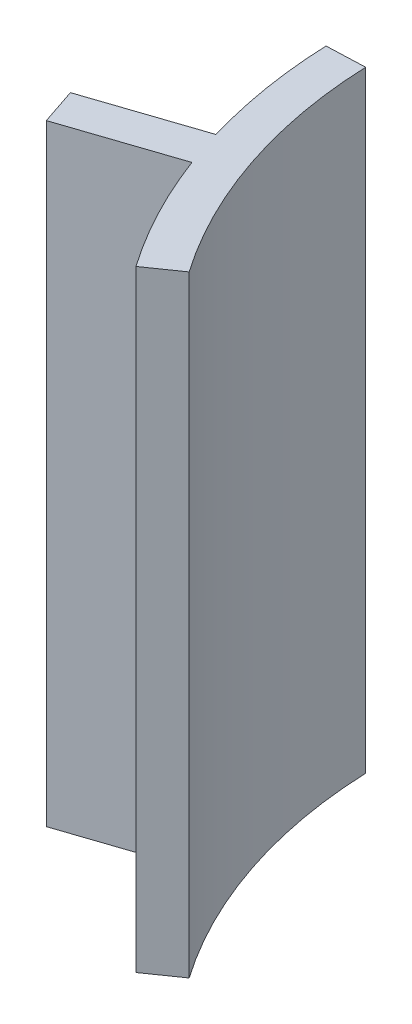
ISO-10303-21;
HEADER;
FILE_DESCRIPTION(('STEP AP214'),'2;1');
FILE_NAME('part.step','',(''),(''),'','','');
FILE_SCHEMA(('AUTOMOTIVE_DESIGN { 1 0 10303 214 1 1 1 1 }'));
ENDSEC;
DATA;
#1=APPLICATION_CONTEXT('core data for automotive mechanical design processes');
#2=APPLICATION_PROTOCOL_DEFINITION('international standard','automotive_design',2000,#1);
#3=PRODUCT_CONTEXT('',#1,'mechanical');
#4=PRODUCT('Part','Part','',(#3));
#5=PRODUCT_RELATED_PRODUCT_CATEGORY('part','',(#4));
#6=PRODUCT_DEFINITION_FORMATION('','',#4);
#7=PRODUCT_DEFINITION_CONTEXT('part definition',#1,'design');
#8=PRODUCT_DEFINITION('design','',#6,#7);
#9=PRODUCT_DEFINITION_SHAPE('','',#8);
#10=(LENGTH_UNIT() NAMED_UNIT(*) SI_UNIT(.MILLI.,.METRE.));
#11=(NAMED_UNIT(*) PLANE_ANGLE_UNIT() SI_UNIT($,.RADIAN.));
#12=(NAMED_UNIT(*) SI_UNIT($,.STERADIAN.) SOLID_ANGLE_UNIT());
#13=UNCERTAINTY_MEASURE_WITH_UNIT(LENGTH_MEASURE(1.E-05),#10,'distance_accuracy_value','');
#14=(GEOMETRIC_REPRESENTATION_CONTEXT(3) GLOBAL_UNCERTAINTY_ASSIGNED_CONTEXT((#13)) GLOBAL_UNIT_ASSIGNED_CONTEXT((#10,
#11,#12)) REPRESENTATION_CONTEXT('',''));
#15=CARTESIAN_POINT('',(0.,0.,0.));
#16=DIRECTION('',(0.,0.,1.));
#17=DIRECTION('',(1.,0.,0.));
#18=AXIS2_PLACEMENT_3D('',#15,#16,#17);
#19=CARTESIAN_POINT('',(0.794627868658572,80.,2.37035156682687));
#20=DIRECTION('',(-0.317851147463239,0.,-0.948140626730182));
#21=DIRECTION('',(-0.948140626730182,0.,0.317851147463239));
#22=AXIS2_PLACEMENT_3D('',#19,#20,#21);
#23=PLANE('',#22);
#24=DIRECTION('',(0.948140626730182,0.,-0.317851147463239));
#25=VECTOR('',#24,1.);
#26=CARTESIAN_POINT('',(0.794627868658572,0.,2.37035156682687));
#27=LINE('',#26,#25);
#28=CARTESIAN_POINT('',(-79.7973254034787,0.,29.3876991012263));
#29=VERTEX_POINT('',#28);
#30=CARTESIAN_POINT('',(-65.5328747900053,0.,24.6057375782174));
#31=VERTEX_POINT('',#30);
#32=EDGE_CURVE('E142',#29,#31,#27,.T.);
#33=ORIENTED_EDGE('',*,*,#32,.T.);
#34=DIRECTION('',(0.,-1.,0.));
#35=VECTOR('',#34,1.);
#36=CARTESIAN_POINT('',(-65.5328747900053,80.,24.6057375782174));
#37=LINE('',#36,#35);
#38=CARTESIAN_POINT('',(-65.5328747900053,80.,24.6057375782174));
#39=VERTEX_POINT('',#38);
#40=EDGE_CURVE('E11',#39,#31,#37,.T.);
#41=ORIENTED_EDGE('',*,*,#40,.F.);
#42=DIRECTION('',(0.948140626730182,0.,-0.317851147463239));
#43=VECTOR('',#42,1.);
#44=CARTESIAN_POINT('',(0.794627868658572,80.,2.37035156682687));
#45=LINE('',#44,#43);
#46=CARTESIAN_POINT('',(-79.7973254034787,80.,29.3876991012263));
#47=VERTEX_POINT('',#46);
#48=EDGE_CURVE('E168',#47,#39,#45,.T.);
#49=ORIENTED_EDGE('',*,*,#48,.F.);
#50=DIRECTION('',(0.,-1.,0.));
#51=VECTOR('',#50,1.);
#52=CARTESIAN_POINT('',(-79.7973254034787,80.,29.3876991012263));
#53=LINE('',#52,#51);
#54=EDGE_CURVE('E56',#47,#29,#53,.T.);
#55=ORIENTED_EDGE('',*,*,#54,.T.);
#56=EDGE_LOOP('',(#33,#41,#49,#55));
#57=FACE_BOUND('',#56,.T.);
#58=ADVANCED_FACE('F39',(#57),#23,.F.);
#59=CARTESIAN_POINT('',(0.,80.,0.));
#60=DIRECTION('',(0.,-1.,0.));
#61=DIRECTION('',(0.,0.,-1.));
#62=AXIS2_PLACEMENT_3D('',#59,#60,#61);
#63=CYLINDRICAL_SURFACE('',#62,70.0000000000757);
#64=CARTESIAN_POINT('',(0.,0.,0.));
#65=DIRECTION('',(0.,1.,0.));
#66=DIRECTION('',(0.,0.,1.));
#67=AXIS2_PLACEMENT_3D('',#64,#65,#66);
#68=CIRCLE('',#67,70.0000000000757);
#69=CARTESIAN_POINT('',(-57.4085194862445,0.,40.0532382012755));
#70=VERTEX_POINT('',#69);
#71=EDGE_CURVE('E145',#31,#70,#68,.T.);
#72=ORIENTED_EDGE('',*,*,#71,.T.);
#73=DIRECTION('',(0.,-1.,0.));
#74=VECTOR('',#73,1.);
#75=CARTESIAN_POINT('',(-57.4085194862445,80.,40.0532382012755));
#76=LINE('',#75,#74);
#77=CARTESIAN_POINT('',(-57.4085194862445,80.,40.0532382012755));
#78=VERTEX_POINT('',#77);
#79=EDGE_CURVE('E48',#78,#70,#76,.T.);
#80=ORIENTED_EDGE('',*,*,#79,.F.);
#81=CARTESIAN_POINT('',(0.,80.,0.));
#82=DIRECTION('',(0.,1.,0.));
#83=DIRECTION('',(0.,0.,1.));
#84=AXIS2_PLACEMENT_3D('',#81,#82,#83);
#85=CIRCLE('',#84,70.0000000000757);
#86=EDGE_CURVE('E94',#39,#78,#85,.T.);
#87=ORIENTED_EDGE('',*,*,#86,.F.);
#88=ORIENTED_EDGE('',*,*,#40,.T.);
#89=EDGE_LOOP('',(#72,#80,#87,#88));
#90=FACE_BOUND('',#89,.T.);
#91=ADVANCED_FACE('F206',(#90),#63,.T.);
#92=CARTESIAN_POINT('',(0.,80.,0.));
#93=DIRECTION('',(-0.572189117160459,0.,-0.82012170694546));
#94=DIRECTION('',(-0.82012170694546,0.,0.572189117160459));
#95=AXIS2_PLACEMENT_3D('',#92,#93,#94);
#96=PLANE('',#95);
#97=DIRECTION('',(0.82012170694546,0.,-0.572189117160459));
#98=VECTOR('',#97,1.);
#99=CARTESIAN_POINT('',(0.,0.,0.));
#100=LINE('',#99,#98);
#101=CARTESIAN_POINT('',(-53.3079109514551,0.,37.1922926154299));
#102=VERTEX_POINT('',#101);
#103=EDGE_CURVE('E148',#70,#102,#100,.T.);
#104=ORIENTED_EDGE('',*,*,#103,.T.);
#105=DIRECTION('',(0.,-1.,0.));
#106=VECTOR('',#105,1.);
#107=CARTESIAN_POINT('',(-53.3079109514551,80.,37.1922926154299));
#108=LINE('',#107,#106);
#109=CARTESIAN_POINT('',(-53.3079109514551,80.,37.1922926154299));
#110=VERTEX_POINT('',#109);
#111=EDGE_CURVE('E178',#110,#102,#108,.T.);
#112=ORIENTED_EDGE('',*,*,#111,.F.);
#113=DIRECTION('',(0.82012170694546,0.,-0.572189117160459));
#114=VECTOR('',#113,1.);
#115=CARTESIAN_POINT('',(0.,80.,0.));
#116=LINE('',#115,#114);
#117=EDGE_CURVE('E187',#78,#110,#116,.T.);
#118=ORIENTED_EDGE('',*,*,#117,.F.);
#119=ORIENTED_EDGE('',*,*,#79,.T.);
#120=EDGE_LOOP('',(#104,#112,#118,#119));
#121=FACE_BOUND('',#120,.T.);
#122=ADVANCED_FACE('F185',(#121),#96,.F.);
#123=CARTESIAN_POINT('',(0.,80.,0.));
#124=DIRECTION('',(0.,-1.,0.));
#125=DIRECTION('',(0.,0.,-1.));
#126=AXIS2_PLACEMENT_3D('',#123,#124,#125);
#127=CYLINDRICAL_SURFACE('',#126,65.);
#128=CARTESIAN_POINT('',(0.,0.,0.));
#129=DIRECTION('',(0.,1.,0.));
#130=DIRECTION('',(0.,0.,1.));
#131=AXIS2_PLACEMENT_3D('',#128,#129,#130);
#132=CIRCLE('',#131,65.);
#133=CARTESIAN_POINT('',(-64.953686456397,0.,2.45328671868501));
#134=VERTEX_POINT('',#133);
#135=EDGE_CURVE('E152',#134,#102,#132,.T.);
#136=ORIENTED_EDGE('',*,*,#135,.F.);
#137=DIRECTION('',(0.,-1.,0.));
#138=VECTOR('',#137,1.);
#139=CARTESIAN_POINT('',(-64.953686456397,80.,2.45328671868501));
#140=LINE('',#139,#138);
#141=CARTESIAN_POINT('',(-64.953686456397,80.,2.45328671868501));
#142=VERTEX_POINT('',#141);
#143=EDGE_CURVE('E175',#142,#134,#140,.T.);
#144=ORIENTED_EDGE('',*,*,#143,.F.);
#145=CARTESIAN_POINT('',(0.,80.,0.));
#146=DIRECTION('',(0.,1.,0.));
#147=DIRECTION('',(0.,0.,1.));
#148=AXIS2_PLACEMENT_3D('',#145,#146,#147);
#149=CIRCLE('',#148,65.);
#150=EDGE_CURVE('E195',#142,#110,#149,.T.);
#151=ORIENTED_EDGE('',*,*,#150,.T.);
#152=ORIENTED_EDGE('',*,*,#111,.T.);
#153=EDGE_LOOP('',(#136,#144,#151,#152));
#154=FACE_BOUND('',#153,.T.);
#155=ADVANCED_FACE('F193',(#154),#127,.F.);
#156=CARTESIAN_POINT('',(0.,80.,0.));
#157=DIRECTION('',(0.037742872595154,0.,0.999287483944568));
#158=DIRECTION('',(0.999287483944568,0.,-0.037742872595154));
#159=AXIS2_PLACEMENT_3D('',#156,#157,#158);
#160=PLANE('',#159);
#161=DIRECTION('',(-0.999287483944568,0.,0.037742872595154));
#162=VECTOR('',#161,1.);
#163=CARTESIAN_POINT('',(0.,0.,0.));
#164=LINE('',#163,#162);
#165=CARTESIAN_POINT('',(-69.9501238761955,0.,2.64200108166364));
#166=VERTEX_POINT('',#165);
#167=EDGE_CURVE('E156',#134,#166,#164,.T.);
#168=ORIENTED_EDGE('',*,*,#167,.T.);
#169=DIRECTION('',(0.,-1.,0.));
#170=VECTOR('',#169,1.);
#171=CARTESIAN_POINT('',(-69.9501238761955,80.,2.64200108166364));
#172=LINE('',#171,#170);
#173=CARTESIAN_POINT('',(-69.9501238761955,80.,2.64200108166364));
#174=VERTEX_POINT('',#173);
#175=EDGE_CURVE('E132',#174,#166,#172,.T.);
#176=ORIENTED_EDGE('',*,*,#175,.F.);
#177=DIRECTION('',(-0.999287483944568,0.,0.037742872595154));
#178=VECTOR('',#177,1.);
#179=CARTESIAN_POINT('',(0.,80.,0.));
#180=LINE('',#179,#178);
#181=EDGE_CURVE('E118',#142,#174,#180,.T.);
#182=ORIENTED_EDGE('',*,*,#181,.F.);
#183=ORIENTED_EDGE('',*,*,#143,.T.);
#184=EDGE_LOOP('',(#168,#176,#182,#183));
#185=FACE_BOUND('',#184,.T.);
#186=ADVANCED_FACE('F216',(#185),#160,.F.);
#187=CARTESIAN_POINT('',(0.,80.,0.));
#188=DIRECTION('',(0.,-1.,0.));
#189=DIRECTION('',(0.,0.,-1.));
#190=AXIS2_PLACEMENT_3D('',#187,#188,#189);
#191=CYLINDRICAL_SURFACE('',#190,70.0000000000758);
#192=CARTESIAN_POINT('',(0.,0.,0.));
#193=DIRECTION('',(0.,1.,0.));
#194=DIRECTION('',(0.,0.,1.));
#195=AXIS2_PLACEMENT_3D('',#192,#193,#194);
#196=CIRCLE('',#195,70.0000000000758);
#197=CARTESIAN_POINT('',(-67.1221305273224,0.,19.8650344445636));
#198=VERTEX_POINT('',#197);
#199=EDGE_CURVE('E128',#166,#198,#196,.T.);
#200=ORIENTED_EDGE('',*,*,#199,.T.);
#201=DIRECTION('',(0.,-1.,0.));
#202=VECTOR('',#201,1.);
#203=CARTESIAN_POINT('',(-67.1221305273224,80.,19.8650344445636));
#204=LINE('',#203,#202);
#205=CARTESIAN_POINT('',(-67.1221305273224,80.,19.8650344445636));
#206=VERTEX_POINT('',#205);
#207=EDGE_CURVE('E125',#206,#198,#204,.T.);
#208=ORIENTED_EDGE('',*,*,#207,.F.);
#209=CARTESIAN_POINT('',(0.,80.,0.));
#210=DIRECTION('',(0.,1.,0.));
#211=DIRECTION('',(0.,0.,1.));
#212=AXIS2_PLACEMENT_3D('',#209,#210,#211);
#213=CIRCLE('',#212,70.0000000000758);
#214=EDGE_CURVE('E110',#174,#206,#213,.T.);
#215=ORIENTED_EDGE('',*,*,#214,.F.);
#216=ORIENTED_EDGE('',*,*,#175,.T.);
#217=EDGE_LOOP('',(#200,#208,#215,#216));
#218=FACE_BOUND('',#217,.T.);
#219=ADVANCED_FACE('F126',(#218),#191,.T.);
#220=CARTESIAN_POINT('',(-0.794627868658574,80.,-2.37035156682689));
#221=DIRECTION('',(-0.317851147463238,0.,-0.948140626730182));
#222=DIRECTION('',(-0.948140626730182,0.,0.317851147463238));
#223=AXIS2_PLACEMENT_3D('',#220,#221,#222);
#224=PLANE('',#223);
#225=DIRECTION('',(0.948140626730182,0.,-0.317851147463238));
#226=VECTOR('',#225,1.);
#227=CARTESIAN_POINT('',(-0.794627868658574,0.,-2.37035156682689));
#228=LINE('',#227,#226);
#229=CARTESIAN_POINT('',(-81.3865811407959,0.,24.6469959675724));
#230=VERTEX_POINT('',#229);
#231=EDGE_CURVE('E161',#230,#198,#228,.T.);
#232=ORIENTED_EDGE('',*,*,#231,.F.);
#233=DIRECTION('',(0.,-1.,0.));
#234=VECTOR('',#233,1.);
#235=CARTESIAN_POINT('',(-81.3865811407959,80.,24.6469959675724));
#236=LINE('',#235,#234);
#237=CARTESIAN_POINT('',(-81.3865811407959,80.,24.6469959675724));
#238=VERTEX_POINT('',#237);
#239=EDGE_CURVE('E82',#238,#230,#236,.T.);
#240=ORIENTED_EDGE('',*,*,#239,.F.);
#241=DIRECTION('',(0.948140626730182,0.,-0.317851147463238));
#242=VECTOR('',#241,1.);
#243=CARTESIAN_POINT('',(-0.794627868658574,80.,-2.37035156682689));
#244=LINE('',#243,#242);
#245=EDGE_CURVE('E115',#238,#206,#244,.T.);
#246=ORIENTED_EDGE('',*,*,#245,.T.);
#247=ORIENTED_EDGE('',*,*,#207,.T.);
#248=EDGE_LOOP('',(#232,#240,#246,#247));
#249=FACE_BOUND('',#248,.T.);
#250=ADVANCED_FACE('F134',(#249),#224,.T.);
#251=CARTESIAN_POINT('',(-80.5919532721373,80.,27.0173475343992));
#252=DIRECTION('',(-0.948140626730183,0.,0.317851147463237));
#253=DIRECTION('',(0.317851147463237,0.,0.948140626730183));
#254=AXIS2_PLACEMENT_3D('',#251,#252,#253);
#255=PLANE('',#254);
#256=DIRECTION('',(-0.317851147463237,0.,-0.948140626730183));
#257=VECTOR('',#256,1.);
#258=CARTESIAN_POINT('',(-80.5919532721373,0.,27.0173475343992));
#259=LINE('',#258,#257);
#260=EDGE_CURVE('E164',#29,#230,#259,.T.);
#261=ORIENTED_EDGE('',*,*,#260,.F.);
#262=ORIENTED_EDGE('',*,*,#54,.F.);
#263=DIRECTION('',(-0.317851147463237,0.,-0.948140626730183));
#264=VECTOR('',#263,1.);
#265=CARTESIAN_POINT('',(-80.5919532721373,80.,27.0173475343992));
#266=LINE('',#265,#264);
#267=EDGE_CURVE('E136',#47,#238,#266,.T.);
#268=ORIENTED_EDGE('',*,*,#267,.T.);
#269=ORIENTED_EDGE('',*,*,#239,.T.);
#270=EDGE_LOOP('',(#261,#262,#268,#269));
#271=FACE_BOUND('',#270,.T.);
#272=ADVANCED_FACE('F224',(#271),#255,.T.);
#273=CARTESIAN_POINT('',(0.,80.,0.));
#274=DIRECTION('',(0.,1.,0.));
#275=DIRECTION('',(0.,0.,1.));
#276=AXIS2_PLACEMENT_3D('',#273,#274,#275);
#277=PLANE('',#276);
#278=ORIENTED_EDGE('',*,*,#48,.T.);
#279=ORIENTED_EDGE('',*,*,#86,.T.);
#280=ORIENTED_EDGE('',*,*,#117,.T.);
#281=ORIENTED_EDGE('',*,*,#150,.F.);
#282=ORIENTED_EDGE('',*,*,#181,.T.);
#283=ORIENTED_EDGE('',*,*,#214,.T.);
#284=ORIENTED_EDGE('',*,*,#245,.F.);
#285=ORIENTED_EDGE('',*,*,#267,.F.);
#286=EDGE_LOOP('',(#278,#279,#280,#281,#282,#283,#284,#285));
#287=FACE_BOUND('',#286,.T.);
#288=ADVANCED_FACE('F112',(#287),#277,.T.);
#289=CARTESIAN_POINT('',(0.,0.,0.));
#290=DIRECTION('',(0.,1.,0.));
#291=DIRECTION('',(0.,0.,1.));
#292=AXIS2_PLACEMENT_3D('',#289,#290,#291);
#293=PLANE('',#292);
#294=ORIENTED_EDGE('',*,*,#32,.F.);
#295=ORIENTED_EDGE('',*,*,#260,.T.);
#296=ORIENTED_EDGE('',*,*,#231,.T.);
#297=ORIENTED_EDGE('',*,*,#199,.F.);
#298=ORIENTED_EDGE('',*,*,#167,.F.);
#299=ORIENTED_EDGE('',*,*,#135,.T.);
#300=ORIENTED_EDGE('',*,*,#103,.F.);
#301=ORIENTED_EDGE('',*,*,#71,.F.);
#302=EDGE_LOOP('',(#294,#295,#296,#297,#298,#299,#300,#301));
#303=FACE_BOUND('',#302,.T.);
#304=ADVANCED_FACE('F189',(#303),#293,.F.);
#305=CLOSED_SHELL('',(#58,#91,#122,#155,#186,#219,#250,#272,#288,#304));
#306=MANIFOLD_SOLID_BREP('B2',#305);
#307=ADVANCED_BREP_SHAPE_REPRESENTATION('',(#18,#306),#14);
#308=SHAPE_DEFINITION_REPRESENTATION(#9,#307);
ENDSEC;
END-ISO-10303-21;
